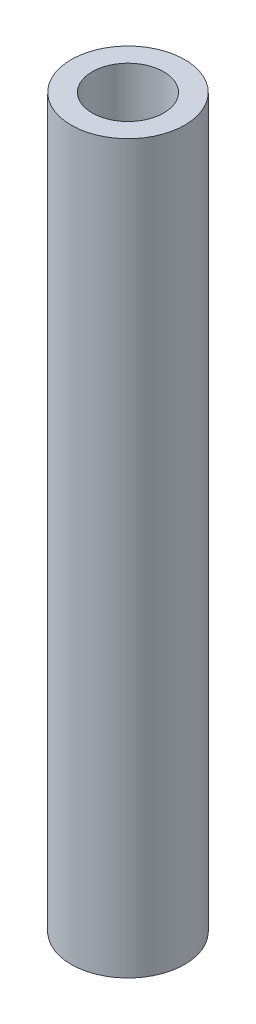
ISO-10303-21;
HEADER;
FILE_DESCRIPTION(('STEP AP214'),'2;1');
FILE_NAME('part.step','',(''),(''),'','','');
FILE_SCHEMA(('AUTOMOTIVE_DESIGN { 1 0 10303 214 1 1 1 1 }'));
ENDSEC;
DATA;
#1=APPLICATION_CONTEXT('core data for automotive mechanical design processes');
#2=APPLICATION_PROTOCOL_DEFINITION('international standard','automotive_design',2000,#1);
#3=PRODUCT_CONTEXT('',#1,'mechanical');
#4=PRODUCT('Part','Part','',(#3));
#5=PRODUCT_RELATED_PRODUCT_CATEGORY('part','',(#4));
#6=PRODUCT_DEFINITION_FORMATION('','',#4);
#7=PRODUCT_DEFINITION_CONTEXT('part definition',#1,'design');
#8=PRODUCT_DEFINITION('design','',#6,#7);
#9=PRODUCT_DEFINITION_SHAPE('','',#8);
#10=(LENGTH_UNIT() NAMED_UNIT(*) SI_UNIT(.MILLI.,.METRE.));
#11=(NAMED_UNIT(*) PLANE_ANGLE_UNIT() SI_UNIT($,.RADIAN.));
#12=(NAMED_UNIT(*) SI_UNIT($,.STERADIAN.) SOLID_ANGLE_UNIT());
#13=UNCERTAINTY_MEASURE_WITH_UNIT(LENGTH_MEASURE(1.E-05),#10,'distance_accuracy_value','');
#14=(GEOMETRIC_REPRESENTATION_CONTEXT(3) GLOBAL_UNCERTAINTY_ASSIGNED_CONTEXT((#13)) GLOBAL_UNIT_ASSIGNED_CONTEXT((#10,
#11,#12)) REPRESENTATION_CONTEXT('',''));
#15=CARTESIAN_POINT('',(0.,0.,0.));
#16=DIRECTION('',(0.,0.,1.));
#17=DIRECTION('',(1.,0.,0.));
#18=AXIS2_PLACEMENT_3D('',#15,#16,#17);
#19=CARTESIAN_POINT('',(0.,-40.64,0.));
#20=DIRECTION('',(0.,1.,0.));
#21=DIRECTION('',(0.,0.,1.));
#22=AXIS2_PLACEMENT_3D('',#19,#20,#21);
#23=CYLINDRICAL_SURFACE('',#22,3.175);
#24=CARTESIAN_POINT('',(0.,-40.64,0.));
#25=DIRECTION('',(0.,1.,0.));
#26=DIRECTION('',(0.,0.,1.));
#27=AXIS2_PLACEMENT_3D('',#24,#25,#26);
#28=CIRCLE('',#27,3.175);
#29=CARTESIAN_POINT('',(0.,-40.64,3.175));
#30=VERTEX_POINT('',#29);
#31=EDGE_CURVE('E10',#30,#30,#28,.T.);
#32=ORIENTED_EDGE('',*,*,#31,.T.);
#33=EDGE_LOOP('',(#32));
#34=FACE_BOUND('',#33,.T.);
#35=CARTESIAN_POINT('',(0.,0.,0.));
#36=DIRECTION('',(0.,1.,0.));
#37=DIRECTION('',(0.,0.,1.));
#38=AXIS2_PLACEMENT_3D('',#35,#36,#37);
#39=CIRCLE('',#38,3.175);
#40=CARTESIAN_POINT('',(0.,0.,3.175));
#41=VERTEX_POINT('',#40);
#42=EDGE_CURVE('E42',#41,#41,#39,.T.);
#43=ORIENTED_EDGE('',*,*,#42,.F.);
#44=EDGE_LOOP('',(#43));
#45=FACE_BOUND('',#44,.T.);
#46=ADVANCED_FACE('F39',(#34,#45),#23,.T.);
#47=CARTESIAN_POINT('',(0.,-40.64,0.));
#48=DIRECTION('',(0.,1.,0.));
#49=DIRECTION('',(0.,0.,1.));
#50=AXIS2_PLACEMENT_3D('',#47,#48,#49);
#51=PLANE('',#50);
#52=CARTESIAN_POINT('',(0.,-40.64,0.));
#53=DIRECTION('',(0.,1.,0.));
#54=DIRECTION('',(0.,0.,1.));
#55=AXIS2_PLACEMENT_3D('',#52,#53,#54);
#56=CIRCLE('',#55,2.);
#57=CARTESIAN_POINT('',(0.,-40.64,2.));
#58=VERTEX_POINT('',#57);
#59=EDGE_CURVE('E49',#58,#58,#56,.T.);
#60=ORIENTED_EDGE('',*,*,#59,.T.);
#61=EDGE_LOOP('',(#60));
#62=FACE_BOUND('',#61,.T.);
#63=ORIENTED_EDGE('',*,*,#31,.F.);
#64=EDGE_LOOP('',(#63));
#65=FACE_BOUND('',#64,.T.);
#66=ADVANCED_FACE('F57',(#62,#65),#51,.F.);
#67=CARTESIAN_POINT('',(0.,0.,0.));
#68=DIRECTION('',(0.,1.,0.));
#69=DIRECTION('',(0.,0.,1.));
#70=AXIS2_PLACEMENT_3D('',#67,#68,#69);
#71=PLANE('',#70);
#72=CARTESIAN_POINT('',(0.,0.,0.));
#73=DIRECTION('',(0.,1.,0.));
#74=DIRECTION('',(0.,0.,1.));
#75=AXIS2_PLACEMENT_3D('',#72,#73,#74);
#76=CIRCLE('',#75,2.);
#77=CARTESIAN_POINT('',(0.,0.,2.));
#78=VERTEX_POINT('',#77);
#79=EDGE_CURVE('E51',#78,#78,#76,.T.);
#80=ORIENTED_EDGE('',*,*,#79,.F.);
#81=EDGE_LOOP('',(#80));
#82=FACE_BOUND('',#81,.T.);
#83=ORIENTED_EDGE('',*,*,#42,.T.);
#84=EDGE_LOOP('',(#83));
#85=FACE_BOUND('',#84,.T.);
#86=ADVANCED_FACE('F63',(#82,#85),#71,.T.);
#87=CARTESIAN_POINT('',(0.,-40.64,0.));
#88=DIRECTION('',(0.,1.,0.));
#89=DIRECTION('',(0.,0.,1.));
#90=AXIS2_PLACEMENT_3D('',#87,#88,#89);
#91=CYLINDRICAL_SURFACE('',#90,2.);
#92=ORIENTED_EDGE('',*,*,#59,.F.);
#93=EDGE_LOOP('',(#92));
#94=FACE_BOUND('',#93,.T.);
#95=ORIENTED_EDGE('',*,*,#79,.T.);
#96=EDGE_LOOP('',(#95));
#97=FACE_BOUND('',#96,.T.);
#98=ADVANCED_FACE('F60',(#94,#97),#91,.F.);
#99=CLOSED_SHELL('',(#46,#66,#86,#98));
#100=MANIFOLD_SOLID_BREP('B2',#99);
#101=ADVANCED_BREP_SHAPE_REPRESENTATION('',(#18,#100),#14);
#102=SHAPE_DEFINITION_REPRESENTATION(#9,#101);
ENDSEC;
END-ISO-10303-21;
